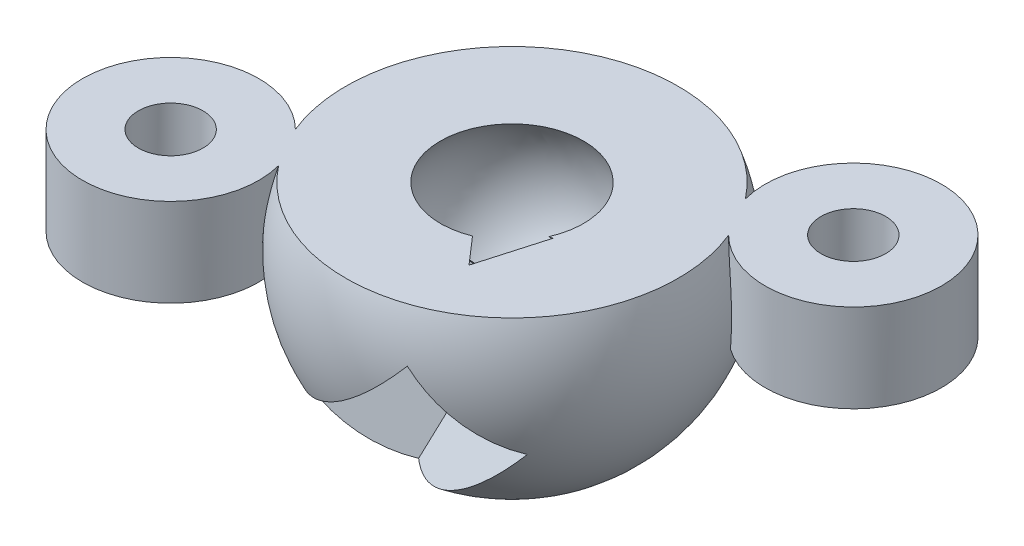
ISO-10303-21;
HEADER;
FILE_DESCRIPTION(('STEP AP214'),'2;1');
FILE_NAME('part.step','',(''),(''),'','','');
FILE_SCHEMA(('AUTOMOTIVE_DESIGN { 1 0 10303 214 1 1 1 1 }'));
ENDSEC;
DATA;
#1=APPLICATION_CONTEXT('core data for automotive mechanical design processes');
#2=APPLICATION_PROTOCOL_DEFINITION('international standard','automotive_design',2000,#1);
#3=PRODUCT_CONTEXT('',#1,'mechanical');
#4=PRODUCT('Part','Part','',(#3));
#5=PRODUCT_RELATED_PRODUCT_CATEGORY('part','',(#4));
#6=PRODUCT_DEFINITION_FORMATION('','',#4);
#7=PRODUCT_DEFINITION_CONTEXT('part definition',#1,'design');
#8=PRODUCT_DEFINITION('design','',#6,#7);
#9=PRODUCT_DEFINITION_SHAPE('','',#8);
#10=(LENGTH_UNIT() NAMED_UNIT(*) SI_UNIT(.MILLI.,.METRE.));
#11=(NAMED_UNIT(*) PLANE_ANGLE_UNIT() SI_UNIT($,.RADIAN.));
#12=(NAMED_UNIT(*) SI_UNIT($,.STERADIAN.) SOLID_ANGLE_UNIT());
#13=UNCERTAINTY_MEASURE_WITH_UNIT(LENGTH_MEASURE(1.E-05),#10,'distance_accuracy_value','');
#14=(GEOMETRIC_REPRESENTATION_CONTEXT(3) GLOBAL_UNCERTAINTY_ASSIGNED_CONTEXT((#13)) GLOBAL_UNIT_ASSIGNED_CONTEXT((#10,
#11,#12)) REPRESENTATION_CONTEXT('',''));
#15=CARTESIAN_POINT('',(0.,0.,0.));
#16=DIRECTION('',(0.,0.,1.));
#17=DIRECTION('',(1.,0.,0.));
#18=AXIS2_PLACEMENT_3D('',#15,#16,#17);
#19=CARTESIAN_POINT('',(-71.2916512459885,-73.,-25.9807621135332));
#20=DIRECTION('',(0.,-1.,0.));
#21=DIRECTION('',(0.5,0.,0.866025403784439));
#22=AXIS2_PLACEMENT_3D('',#19,#20,#21);
#23=SPHERICAL_SURFACE('',#22,5.99999999999999);
#24=CARTESIAN_POINT('',(-71.2916512459885,-71.,-25.9807621135332));
#25=DIRECTION('',(0.,-1.,0.));
#26=DIRECTION('',(0.,0.,-1.));
#27=AXIS2_PLACEMENT_3D('',#24,#25,#26);
#28=CIRCLE('',#27,5.65685424949238);
#29=CARTESIAN_POINT('',(-76.5335077636322,-71.,-23.8540415751369));
#30=VERTEX_POINT('',#29);
#31=CARTESIAN_POINT('',(-66.8289289741654,-71.,-29.4569827516075));
#32=VERTEX_POINT('',#31);
#33=EDGE_CURVE('E241',#30,#32,#28,.T.);
#34=ORIENTED_EDGE('',*,*,#33,.T.);
#35=CARTESIAN_POINT('',(-66.8288822258958,-70.9998000000002,-29.4568076588764));
#36=CARTESIAN_POINT('',(-66.8354414206612,-71.0278724460281,-29.4813823960372));
#37=CARTESIAN_POINT('',(-66.841445409668,-71.0567865660781,-29.5051093240685));
#38=CARTESIAN_POINT('',(-66.8524806169469,-71.1160434934823,-29.550902644208));
#39=CARTESIAN_POINT('',(-66.8575126129428,-71.1463851342514,-29.5729703552028));
#40=CARTESIAN_POINT('',(-66.8713343923544,-71.2389943886752,-29.6366255474556));
#41=CARTESIAN_POINT('',(-66.8788996674251,-71.3030725103162,-29.6758589353656));
#42=CARTESIAN_POINT('',(-66.8915697555255,-71.4339893832938,-29.7480515512125));
#43=CARTESIAN_POINT('',(-66.8966986091235,-71.5007937830544,-29.781070054829));
#44=CARTESIAN_POINT('',(-66.9052664855146,-71.6369688871942,-29.8417667876296));
#45=CARTESIAN_POINT('',(-66.9087034252679,-71.7063426425282,-29.8694384085501));
#46=CARTESIAN_POINT('',(-66.9152554415977,-71.8687142272826,-29.9275235502486));
#47=CARTESIAN_POINT('',(-66.9179411853033,-71.9623745047606,-29.9561321338083));
#48=CARTESIAN_POINT('',(-66.9220516329804,-72.151862770387,-30.0052942753258));
#49=CARTESIAN_POINT('',(-66.9234752841625,-72.2476925000111,-30.0258411005248));
#50=CARTESIAN_POINT('',(-66.9255828951422,-72.4413341169986,-30.0593722829475));
#51=CARTESIAN_POINT('',(-66.9262617698337,-72.5391550423465,-30.0723043750706));
#52=CARTESIAN_POINT('',(-66.9271749195194,-72.7354433347075,-30.0906365320708));
#53=CARTESIAN_POINT('',(-66.9274094347238,-72.8339103235679,-30.0960406659649));
#54=CARTESIAN_POINT('',(-66.9275536218137,-73.0229211548647,-30.0992954426495));
#55=CARTESIAN_POINT('',(-66.9274882514551,-73.1134555342486,-30.0977267476702));
#56=CARTESIAN_POINT('',(-66.9270545480834,-73.2941775183518,-30.0883089877937));
#57=CARTESIAN_POINT('',(-66.9266862868461,-73.3843652001413,-30.0804614108083));
#58=CARTESIAN_POINT('',(-66.925507090881,-73.5629332316183,-30.058492759671));
#59=CARTESIAN_POINT('',(-66.9247012652356,-73.6513224558665,-30.0444444341893));
#60=CARTESIAN_POINT('',(-66.922332433785,-73.8268475917444,-30.0098309259609));
#61=CARTESIAN_POINT('',(-66.9207690384522,-73.9139828348421,-29.9892623925339));
#62=CARTESIAN_POINT('',(-66.9186680551725,-74.0002,-29.9653095122775));
#63=B_SPLINE_CURVE_WITH_KNOTS('',3,(#35,#36,#37,#38,#39,#40,#41,#42,#43,#44,#45,#46,#47,#48,#49,
#50,#51,#52,#53,#54,#55,#56,#57,#58,#59,#60,#61,#62),.UNSPECIFIED.,.F.,.F.,(4,2,2,2,2,2,2,2,2,2,
2,2,2,4),(0.,0.113585797209044,0.227080330731855,0.453169231822974,0.676978393535343,
0.901062418299918,1.19454534747411,1.48827285917158,1.78399360635961,2.07955444826494,
2.35098507155562,2.62235139274863,2.89061526718653,3.15901722427217),.UNSPECIFIED.);
#64=CARTESIAN_POINT('',(-66.9186729955711,-74.,-29.9653651328283));
#65=VERTEX_POINT('',#64);
#66=EDGE_CURVE('E199',#32,#65,#63,.T.);
#67=ORIENTED_EDGE('',*,*,#66,.T.);
#68=CARTESIAN_POINT('',(-71.2916512459885,-74.,-25.9807621135332));
#69=DIRECTION('',(0.,-1.,0.));
#70=DIRECTION('',(0.,0.,-1.));
#71=AXIS2_PLACEMENT_3D('',#68,#69,#70);
#72=CIRCLE('',#71,5.91607978309961);
#73=CARTESIAN_POINT('',(-65.654394682074,-74.,-27.7755708589438));
#74=VERTEX_POINT('',#73);
#75=EDGE_CURVE('E246',#74,#65,#72,.F.);
#76=ORIENTED_EDGE('',*,*,#75,.F.);
#77=CARTESIAN_POINT('',(-65.6544403806847,-74.0002,-27.7756029477299));
#78=CARTESIAN_POINT('',(-65.642892880547,-73.9496620404665,-27.7674976990371));
#79=CARTESIAN_POINT('',(-65.6322628224998,-73.8988041487702,-27.7601511822679));
#80=CARTESIAN_POINT('',(-65.6128232199427,-73.7965686087353,-27.746871452643));
#81=CARTESIAN_POINT('',(-65.6040133121323,-73.7451910662704,-27.740937957713));
#82=CARTESIAN_POINT('',(-65.5802949194813,-73.5904873630535,-27.7251024781954));
#83=CARTESIAN_POINT('',(-65.568084640224,-73.4865322631475,-27.7171565006315));
#84=CARTESIAN_POINT('',(-65.550621318443,-73.275745133254,-27.7058650817838));
#85=CARTESIAN_POINT('',(-65.5455100824492,-73.1688967733632,-27.702613361609));
#86=CARTESIAN_POINT('',(-65.5426597638718,-72.9550449188532,-27.7007946397091));
#87=CARTESIAN_POINT('',(-65.5449216944912,-72.8480414049327,-27.7022282818354));
#88=CARTESIAN_POINT('',(-65.5568235037355,-72.6348501805667,-27.7098670650743));
#89=CARTESIAN_POINT('',(-65.5664470059613,-72.5286611870301,-27.7160616153137));
#90=CARTESIAN_POINT('',(-65.5931164782104,-72.3176550384307,-27.73361410612));
#91=CARTESIAN_POINT('',(-65.6101611263616,-72.212837642479,-27.7449711271512));
#92=CARTESIAN_POINT('',(-65.6515693836399,-72.0065978326293,-27.7734617518426));
#93=CARTESIAN_POINT('',(-65.6758539132732,-71.9051512731433,-27.7905331740777));
#94=CARTESIAN_POINT('',(-65.7319176945896,-71.7058549967529,-27.8316219363854));
#95=CARTESIAN_POINT('',(-65.7636903149968,-71.6080021854263,-27.8556331349905));
#96=CARTESIAN_POINT('',(-65.8337600791811,-71.4206435124872,-27.9114291278573));
#97=CARTESIAN_POINT('',(-65.8718158146403,-71.3309707282418,-27.9429404834129));
#98=CARTESIAN_POINT('',(-65.9343732350786,-71.2020077467898,-27.9980492879102));
#99=CARTESIAN_POINT('',(-65.956233326586,-71.1597920463395,-28.0178177275503));
#100=CARTESIAN_POINT('',(-66.0017492084471,-71.0778030739371,-28.0603659931893));
#101=CARTESIAN_POINT('',(-66.0254084367672,-71.0380347549418,-28.0831516496368));
#102=CARTESIAN_POINT('',(-66.0499229889615,-70.9997999999986,-28.1076106834807));
#103=B_SPLINE_CURVE_WITH_KNOTS('',3,(#77,#78,#79,#80,#81,#82,#83,#84,#85,#86,#87,#88,#89,#90,
#91,#92,#93,#94,#95,#96,#97,#98,#99,#100,#101,#102),.UNSPECIFIED.,.F.,.F.,(4,2,2,2,2,2,2,2,2,2,
2,2,4),(0.,0.157377048485897,0.314722654217848,0.629234458382262,0.949942579700582,
1.27069477382293,1.59073549691181,1.91071923689562,2.22732850930349,2.54365844666364,
2.84986255835406,3.00416307873573,3.15876624238513),.UNSPECIFIED.);
#104=CARTESIAN_POINT('',(-66.0497947283448,-71.,-28.1074826519294));
#105=VERTEX_POINT('',#104);
#106=EDGE_CURVE('E188',#74,#105,#103,.T.);
#107=ORIENTED_EDGE('',*,*,#106,.T.);
#108=CARTESIAN_POINT('',(-75.7543735178116,-71.,-22.5045414754588));
#109=VERTEX_POINT('',#108);
#110=EDGE_CURVE('E239',#105,#109,#28,.T.);
#111=ORIENTED_EDGE('',*,*,#110,.T.);
#112=CARTESIAN_POINT('',(-75.7544202660812,-70.9998000000002,-22.5047165681897));
#113=CARTESIAN_POINT('',(-75.7478610713158,-71.0278724460281,-22.480141831029));
#114=CARTESIAN_POINT('',(-75.741857082309,-71.0567865660781,-22.4564149029977));
#115=CARTESIAN_POINT('',(-75.7308218750301,-71.1160434934823,-22.4106215828581));
#116=CARTESIAN_POINT('',(-75.7257898790342,-71.1463851342514,-22.3885538718634));
#117=CARTESIAN_POINT('',(-75.7119680996226,-71.2389943886753,-22.3248986796105));
#118=CARTESIAN_POINT('',(-75.7044028245519,-71.3030725103163,-22.2856652917006));
#119=CARTESIAN_POINT('',(-75.6917327364516,-71.4339893832939,-22.2134726758537));
#120=CARTESIAN_POINT('',(-75.6866038828535,-71.5007937830545,-22.1804541722372));
#121=CARTESIAN_POINT('',(-75.6780360064624,-71.6369688871943,-22.1197574394365));
#122=CARTESIAN_POINT('',(-75.6745990667091,-71.7063426425283,-22.0920858185161));
#123=CARTESIAN_POINT('',(-75.6680470503794,-71.8687142272827,-22.0340006768176));
#124=CARTESIAN_POINT('',(-75.6653613066737,-71.9623745047608,-22.0053920932579));
#125=CARTESIAN_POINT('',(-75.6612508589966,-72.1518627703872,-21.9562299517404));
#126=CARTESIAN_POINT('',(-75.6598272078145,-72.2476925000112,-21.9356831265414));
#127=CARTESIAN_POINT('',(-75.6577195968348,-72.4413341169988,-21.9021519441187));
#128=CARTESIAN_POINT('',(-75.6570407221433,-72.5391550423467,-21.8892198519956));
#129=CARTESIAN_POINT('',(-75.6561275724576,-72.7354433347077,-21.8708876949954));
#130=CARTESIAN_POINT('',(-75.6558930572532,-72.8339103235682,-21.8654835611013));
#131=CARTESIAN_POINT('',(-75.6557488701633,-73.0229211548649,-21.8622287844167));
#132=CARTESIAN_POINT('',(-75.6558142405219,-73.1134555342488,-21.863797479396));
#133=CARTESIAN_POINT('',(-75.6562479438936,-73.294177518352,-21.8732152392726));
#134=CARTESIAN_POINT('',(-75.6566162051309,-73.3843652001414,-21.8810628162579));
#135=CARTESIAN_POINT('',(-75.6577954010961,-73.5629332316184,-21.9030314673953));
#136=CARTESIAN_POINT('',(-75.6586012267414,-73.6513224558665,-21.9170797928769));
#137=CARTESIAN_POINT('',(-75.660970058192,-73.8268475917444,-21.9516933011054));
#138=CARTESIAN_POINT('',(-75.6625334535248,-73.9139828348421,-21.9722618345323));
#139=CARTESIAN_POINT('',(-75.6646344368045,-74.0002,-21.9962147147887));
#140=B_SPLINE_CURVE_WITH_KNOTS('',3,(#112,#113,#114,#115,#116,#117,#118,#119,#120,#121,#122,
#123,#124,#125,#126,#127,#128,#129,#130,#131,#132,#133,#134,#135,#136,#137,#138,#139),
.UNSPECIFIED.,.F.,.F.,(4,2,2,2,2,2,2,2,2,2,2,2,2,4),(0.,0.113585797209057,0.227080330731909,
0.453169231823033,0.67697839353544,0.901062418300023,1.19454534747423,1.48827285917174,
1.78399360635981,2.07955444826517,2.35098507155577,2.62235139274873,2.89061526718655,
3.15901722427214),.UNSPECIFIED.);
#141=CARTESIAN_POINT('',(-75.6646294964059,-74.,-21.9961590942379));
#142=VERTEX_POINT('',#141);
#143=EDGE_CURVE('E234',#109,#142,#140,.T.);
#144=ORIENTED_EDGE('',*,*,#143,.T.);
#145=CARTESIAN_POINT('',(-71.2916512459885,-74.,-25.9807621135332));
#146=DIRECTION('',(0.,-1.,0.));
#147=DIRECTION('',(0.,0.,-1.));
#148=AXIS2_PLACEMENT_3D('',#145,#146,#147);
#149=CIRCLE('',#148,5.91607978309961);
#150=CARTESIAN_POINT('',(-76.9289078099031,-74.,-24.1859533681225));
#151=VERTEX_POINT('',#150);
#152=EDGE_CURVE('E243',#151,#142,#149,.F.);
#153=ORIENTED_EDGE('',*,*,#152,.F.);
#154=CARTESIAN_POINT('',(-76.9288621112924,-74.0002,-24.1859212793364));
#155=CARTESIAN_POINT('',(-76.9404096114301,-73.9496620404665,-24.1940265280293));
#156=CARTESIAN_POINT('',(-76.9510396694773,-73.8988041487702,-24.2013730447985));
#157=CARTESIAN_POINT('',(-76.9704792720344,-73.7965686087353,-24.2146527744234));
#158=CARTESIAN_POINT('',(-76.9792891798448,-73.7451910662703,-24.2205862693533));
#159=CARTESIAN_POINT('',(-77.0030075724958,-73.5904873630535,-24.236421748871));
#160=CARTESIAN_POINT('',(-77.0152178517531,-73.4865322631475,-24.2443677264348));
#161=CARTESIAN_POINT('',(-77.032681173534,-73.2757451332539,-24.2556591452825));
#162=CARTESIAN_POINT('',(-77.0377924095279,-73.1688967733631,-24.2589108654573));
#163=CARTESIAN_POINT('',(-77.0406427281053,-72.9550449188531,-24.2607295873572));
#164=CARTESIAN_POINT('',(-77.0383807974859,-72.8480414049326,-24.259295945231));
#165=CARTESIAN_POINT('',(-77.0264789882416,-72.6348501805666,-24.2516571619921));
#166=CARTESIAN_POINT('',(-77.0168554860158,-72.52866118703,-24.2454626117526));
#167=CARTESIAN_POINT('',(-76.9901860137667,-72.3176550384306,-24.2279101209463));
#168=CARTESIAN_POINT('',(-76.9731413656155,-72.2128376424789,-24.2165530999151));
#169=CARTESIAN_POINT('',(-76.9317331083372,-72.0065978326292,-24.1880624752238));
#170=CARTESIAN_POINT('',(-76.9074485787039,-71.9051512731432,-24.1709910529886));
#171=CARTESIAN_POINT('',(-76.8513847973874,-71.7058549967528,-24.129902290681));
#172=CARTESIAN_POINT('',(-76.8196121769803,-71.6080021854261,-24.1058910920759));
#173=CARTESIAN_POINT('',(-76.7495424127959,-71.4206435124871,-24.0500950992091));
#174=CARTESIAN_POINT('',(-76.7114866773368,-71.3309707282417,-24.0185837436535));
#175=CARTESIAN_POINT('',(-76.6489292568986,-71.2020077467898,-23.9634749391562));
#176=CARTESIAN_POINT('',(-76.6270691653911,-71.1597920463395,-23.9437064995161));
#177=CARTESIAN_POINT('',(-76.58155328353,-71.0778030739371,-23.9011582338771));
#178=CARTESIAN_POINT('',(-76.55789405521,-71.0380347549418,-23.8783725774296));
#179=CARTESIAN_POINT('',(-76.5333795030156,-70.9997999999986,-23.8539135435857));
#180=B_SPLINE_CURVE_WITH_KNOTS('',3,(#154,#155,#156,#157,#158,#159,#160,#161,#162,#163,#164,
#165,#166,#167,#168,#169,#170,#171,#172,#173,#174,#175,#176,#177,#178,#179),.UNSPECIFIED.,.F.,
.F.,(4,2,2,2,2,2,2,2,2,2,2,2,4),(0.,0.157377048485897,0.314722654217877,0.629234458382303,
0.949942579700665,1.27069477382301,1.5907354969119,1.91071923689573,2.22732850930363,
2.54365844666381,2.84986255835412,3.00416307873573,3.15876624238508),.UNSPECIFIED.);
#181=EDGE_CURVE('E227',#151,#30,#180,.T.);
#182=ORIENTED_EDGE('',*,*,#181,.T.);
#183=EDGE_LOOP('',(#34,#67,#76,#107,#111,#144,#153,#182));
#184=FACE_BOUND('',#183,.T.);
#185=CARTESIAN_POINT('',(-72.3829899580333,-71.7684504931306,-25.0308854753731));
#186=DIRECTION('',(0.57438879581302,-0.648183950983877,-0.499935072715847));
#187=DIRECTION('',(0.748425964464048,0.663218346938669,0.));
#188=AXIS2_PLACEMENT_3D('',#185,#186,#187);
#189=CIRCLE('',#188,5.69122131005287);
#190=CARTESIAN_POINT('',(-74.4159921177242,-76.0254293010476,-21.847328714824));
#191=VERTEX_POINT('',#190);
#192=CARTESIAN_POINT('',(-69.2324587112696,-72.5784404179814,-20.3609744285965));
#193=VERTEX_POINT('',#192);
#194=EDGE_CURVE('E135',#191,#193,#189,.F.);
#195=ORIENTED_EDGE('',*,*,#194,.T.);
#196=CARTESIAN_POINT('',(-68.6998845427612,-71.2765055584669,-25.2375849704194));
#197=DIRECTION('',(-0.809927094758531,-0.538592012979103,-0.232242857223047));
#198=DIRECTION('',(0.553732254118609,-0.832694776462975,0.));
#199=AXIS2_PLACEMENT_3D('',#196,#197,#198);
#200=CIRCLE('',#199,5.07543101617978);
#201=CARTESIAN_POINT('',(-67.0497812871801,-75.0415394317201,-22.2607277049167));
#202=VERTEX_POINT('',#201);
#203=EDGE_CURVE('E170',#193,#202,#200,.F.);
#204=ORIENTED_EDGE('',*,*,#203,.T.);
#205=CARTESIAN_POINT('',(-70.2003125339438,-74.2315495068694,-26.9306387516933));
#206=DIRECTION('',(-0.574388795813023,0.648183950983876,0.499935072715846));
#207=DIRECTION('',(-0.748425964464045,-0.663218346938672,0.));
#208=AXIS2_PLACEMENT_3D('',#205,#206,#207);
#209=CIRCLE('',#208,5.69122131005287);
#210=CARTESIAN_POINT('',(-72.2333146936347,-78.4885283147864,-23.7470819911442));
#211=VERTEX_POINT('',#210);
#212=EDGE_CURVE('E160',#202,#211,#209,.F.);
#213=ORIENTED_EDGE('',*,*,#212,.T.);
#214=CARTESIAN_POINT('',(-73.8834179492158,-74.7234944415331,-26.7239392566469));
#215=DIRECTION('',(0.809927094758531,0.538592012979103,0.232242857223047));
#216=DIRECTION('',(-0.553732254118609,0.832694776462975,0.));
#217=AXIS2_PLACEMENT_3D('',#214,#215,#216);
#218=CIRCLE('',#217,5.07543101617982);
#219=EDGE_CURVE('E11',#211,#191,#218,.F.);
#220=ORIENTED_EDGE('',*,*,#219,.T.);
#221=EDGE_LOOP('',(#195,#204,#213,#220));
#222=FACE_BOUND('',#221,.T.);
#223=ADVANCED_FACE('F41',(#184,#222),#23,.T.);
#224=CARTESIAN_POINT('',(-74.1200783707347,-71.,-30.8797415990995));
#225=DIRECTION('',(0.,1.,0.));
#226=DIRECTION('',(0.,0.,1.));
#227=AXIS2_PLACEMENT_3D('',#224,#225,#226);
#228=PLANE('',#227);
#229=CARTESIAN_POINT('',(-63.9304353138208,-71.,-30.2307621135332));
#230=DIRECTION('',(0.,1.,0.));
#231=DIRECTION('',(0.,0.,1.));
#232=AXIS2_PLACEMENT_3D('',#229,#230,#231);
#233=CIRCLE('',#232,1.1);
#234=CARTESIAN_POINT('',(-63.9304353138208,-71.,-29.1307621135332));
#235=VERTEX_POINT('',#234);
#236=EDGE_CURVE('E172',#235,#235,#233,.F.);
#237=ORIENTED_EDGE('',*,*,#236,.T.);
#238=EDGE_LOOP('',(#237));
#239=FACE_BOUND('',#238,.T.);
#240=CARTESIAN_POINT('',(-78.6528671781562,-71.,-21.7307621135332));
#241=DIRECTION('',(0.,1.,0.));
#242=DIRECTION('',(0.,0.,1.));
#243=AXIS2_PLACEMENT_3D('',#240,#241,#242);
#244=CIRCLE('',#243,1.1);
#245=CARTESIAN_POINT('',(-78.6528671781562,-71.,-20.6307621135332));
#246=VERTEX_POINT('',#245);
#247=EDGE_CURVE('E185',#246,#246,#244,.F.);
#248=ORIENTED_EDGE('',*,*,#247,.T.);
#249=EDGE_LOOP('',(#248));
#250=FACE_BOUND('',#249,.T.);
#251=ORIENTED_EDGE('',*,*,#110,.F.);
#252=CARTESIAN_POINT('',(-63.9304353138208,-71.,-30.2307621135332));
#253=DIRECTION('',(0.,-1.,0.));
#254=DIRECTION('',(0.,0.,-1.));
#255=AXIS2_PLACEMENT_3D('',#252,#253,#254);
#256=CIRCLE('',#255,3.);
#257=EDGE_CURVE('E192',#32,#105,#256,.T.);
#258=ORIENTED_EDGE('',*,*,#257,.F.);
#259=ORIENTED_EDGE('',*,*,#33,.F.);
#260=CARTESIAN_POINT('',(-78.6528671781562,-71.,-21.7307621135332));
#261=DIRECTION('',(0.,-1.,0.));
#262=DIRECTION('',(0.,0.,-1.));
#263=AXIS2_PLACEMENT_3D('',#260,#261,#262);
#264=CIRCLE('',#263,3.);
#265=EDGE_CURVE('E295',#109,#30,#264,.T.);
#266=ORIENTED_EDGE('',*,*,#265,.F.);
#267=EDGE_LOOP('',(#251,#258,#259,#266));
#268=FACE_BOUND('',#267,.T.);
#269=DIRECTION('',(-0.275637355817001,0.,0.961261695938318));
#270=VECTOR('',#269,1.);
#271=CARTESIAN_POINT('',(-67.7866482126503,-71.,-29.0636597252431));
#272=LINE('',#271,#270);
#273=CARTESIAN_POINT('',(-68.9449101940788,-71.,-25.0243201614579));
#274=VERTEX_POINT('',#273);
#275=CARTESIAN_POINT('',(-69.5805865905474,-71.,-22.8074531148044));
#276=VERTEX_POINT('',#275);
#277=EDGE_CURVE('E47',#274,#276,#272,.T.);
#278=ORIENTED_EDGE('',*,*,#277,.T.);
#279=DIRECTION('',(-0.65652752938185,0.,-0.754302063608317));
#280=VECTOR('',#279,1.);
#281=CARTESIAN_POINT('',(-75.5347957251093,-71.,-29.6484034730998));
#282=LINE('',#281,#280);
#283=CARTESIAN_POINT('',(-70.3789893275757,-71.,-23.7247594046077));
#284=VERTEX_POINT('',#283);
#285=EDGE_CURVE('E161',#276,#284,#282,.T.);
#286=ORIENTED_EDGE('',*,*,#285,.T.);
#287=CARTESIAN_POINT('',(-71.2916512459885,-71.,-25.9807621135332));
#288=DIRECTION('',(0.,1.,0.));
#289=DIRECTION('',(0.,0.,1.));
#290=AXIS2_PLACEMENT_3D('',#287,#288,#289);
#291=CIRCLE('',#290,2.4336187047276);
#292=CARTESIAN_POINT('',(-69.0609900978729,-71.,-25.0078022776265));
#293=VERTEX_POINT('',#292);
#294=EDGE_CURVE('E184',#293,#284,#291,.T.);
#295=ORIENTED_EDGE('',*,*,#294,.F.);
#296=DIRECTION('',(0.990026908932881,0.,-0.140878385811327));
#297=VECTOR('',#296,1.);
#298=CARTESIAN_POINT('',(-73.2006927646904,-71.,-24.418732804688));
#299=LINE('',#298,#297);
#300=EDGE_CURVE('E61',#293,#274,#299,.T.);
#301=ORIENTED_EDGE('',*,*,#300,.T.);
#302=EDGE_LOOP('',(#278,#286,#295,#301));
#303=FACE_BOUND('',#302,.T.);
#304=ADVANCED_FACE('F223',(#239,#250,#268,#303),#228,.T.);
#305=CARTESIAN_POINT('',(-71.2916512459885,-73.,-25.9807621135332));
#306=DIRECTION('',(-0.866025403784439,0.,0.5));
#307=DIRECTION('',(-0.5,0.,-0.866025403784439));
#308=AXIS2_PLACEMENT_3D('',#305,#306,#307);
#309=SPHERICAL_SURFACE('',#308,3.15);
#310=CARTESIAN_POINT('',(-72.3829899580333,-71.7684504931306,-25.030885475373));
#311=DIRECTION('',(0.57438879581302,-0.648183950983877,-0.499935072715847));
#312=DIRECTION('',(0.748425964464048,0.663218346938669,0.));
#313=AXIS2_PLACEMENT_3D('',#310,#311,#312);
#314=CIRCLE('',#313,2.51246890528022);
#315=CARTESIAN_POINT('',(-74.417906599158,-73.1216461783729,-25.6143884326193));
#316=VERTEX_POINT('',#315);
#317=EDGE_CURVE('E261',#316,#284,#314,.F.);
#318=ORIENTED_EDGE('',*,*,#317,.F.);
#319=CARTESIAN_POINT('',(-71.2916512459885,-73.,-25.9807621135331));
#320=DIRECTION('',(0.118724944390263,-0.538308656109162,0.834342962059054));
#321=DIRECTION('',(0.,-0.840286153588462,-0.542143136161944));
#322=AXIS2_PLACEMENT_3D('',#319,#320,#321);
#323=CIRCLE('',#322,3.15);
#324=CARTESIAN_POINT('',(-72.2352291750685,-75.5847451921117,-27.5141417089396));
#325=VERTEX_POINT('',#324);
#326=EDGE_CURVE('E141',#325,#316,#323,.F.);
#327=ORIENTED_EDGE('',*,*,#326,.F.);
#328=CARTESIAN_POINT('',(-70.2003125339438,-74.2315495068694,-26.9306387516933));
#329=DIRECTION('',(-0.574388795813023,0.648183950983876,0.499935072715846));
#330=DIRECTION('',(-0.748425964464045,-0.663218346938672,0.));
#331=AXIS2_PLACEMENT_3D('',#328,#329,#330);
#332=CIRCLE('',#331,2.51246890528022);
#333=CARTESIAN_POINT('',(-68.165395892819,-72.8783538216271,-26.3471357944469));
#334=VERTEX_POINT('',#333);
#335=EDGE_CURVE('E263',#334,#325,#332,.F.);
#336=ORIENTED_EDGE('',*,*,#335,.F.);
#337=EDGE_CURVE('E248',#293,#334,#323,.F.);
#338=ORIENTED_EDGE('',*,*,#337,.F.);
#339=ORIENTED_EDGE('',*,*,#294,.T.);
#340=EDGE_LOOP('',(#318,#327,#336,#338,#339));
#341=FACE_BOUND('',#340,.T.);
#342=ADVANCED_FACE('F277',(#341),#309,.F.);
#343=CARTESIAN_POINT('',(-63.9304353138208,-74.25,-30.2307621135332));
#344=DIRECTION('',(0.,1.,0.));
#345=DIRECTION('',(0.,0.,1.));
#346=AXIS2_PLACEMENT_3D('',#343,#344,#345);
#347=CYLINDRICAL_SURFACE('',#346,1.1);
#348=ORIENTED_EDGE('',*,*,#236,.F.);
#349=EDGE_LOOP('',(#348));
#350=FACE_BOUND('',#349,.T.);
#351=CARTESIAN_POINT('',(-63.9304353138208,-72.8,-30.2307621135332));
#352=DIRECTION('',(0.,-1.,0.));
#353=DIRECTION('',(0.,0.,-1.));
#354=AXIS2_PLACEMENT_3D('',#351,#352,#353);
#355=CIRCLE('',#354,1.1);
#356=CARTESIAN_POINT('',(-63.9304353138208,-72.8,-31.3307621135332));
#357=VERTEX_POINT('',#356);
#358=EDGE_CURVE('E173',#357,#357,#355,.T.);
#359=ORIENTED_EDGE('',*,*,#358,.T.);
#360=EDGE_LOOP('',(#359));
#361=FACE_BOUND('',#360,.T.);
#362=ADVANCED_FACE('F331',(#350,#361),#347,.F.);
#363=CARTESIAN_POINT('',(-78.6528671781562,-74.25,-21.7307621135332));
#364=DIRECTION('',(0.,1.,0.));
#365=DIRECTION('',(0.,0.,1.));
#366=AXIS2_PLACEMENT_3D('',#363,#364,#365);
#367=CYLINDRICAL_SURFACE('',#366,1.1);
#368=ORIENTED_EDGE('',*,*,#247,.F.);
#369=EDGE_LOOP('',(#368));
#370=FACE_BOUND('',#369,.T.);
#371=CARTESIAN_POINT('',(-78.6528671781562,-72.8,-21.7307621135332));
#372=DIRECTION('',(0.,-1.,0.));
#373=DIRECTION('',(0.,0.,-1.));
#374=AXIS2_PLACEMENT_3D('',#371,#372,#373);
#375=CIRCLE('',#374,1.1);
#376=CARTESIAN_POINT('',(-78.6528671781562,-72.8,-22.8307621135332));
#377=VERTEX_POINT('',#376);
#378=EDGE_CURVE('E181',#377,#377,#375,.T.);
#379=ORIENTED_EDGE('',*,*,#378,.T.);
#380=EDGE_LOOP('',(#379));
#381=FACE_BOUND('',#380,.T.);
#382=ADVANCED_FACE('F222',(#370,#381),#367,.F.);
#383=CARTESIAN_POINT('',(-78.6528671781562,-74.,-21.7307621135332));
#384=DIRECTION('',(0.,1.,0.));
#385=DIRECTION('',(0.,0.,1.));
#386=AXIS2_PLACEMENT_3D('',#383,#384,#385);
#387=CYLINDRICAL_SURFACE('',#386,3.);
#388=ORIENTED_EDGE('',*,*,#143,.F.);
#389=ORIENTED_EDGE('',*,*,#265,.T.);
#390=ORIENTED_EDGE('',*,*,#181,.F.);
#391=CARTESIAN_POINT('',(-78.6528671781562,-74.,-21.7307621135332));
#392=DIRECTION('',(0.,-1.,0.));
#393=DIRECTION('',(0.,0.,-1.));
#394=AXIS2_PLACEMENT_3D('',#391,#392,#393);
#395=CIRCLE('',#394,3.);
#396=EDGE_CURVE('E299',#142,#151,#395,.T.);
#397=ORIENTED_EDGE('',*,*,#396,.F.);
#398=EDGE_LOOP('',(#388,#389,#390,#397));
#399=FACE_BOUND('',#398,.T.);
#400=ADVANCED_FACE('F216',(#399),#387,.T.);
#401=CARTESIAN_POINT('',(-78.6528671781562,-74.,-21.7307621135332));
#402=DIRECTION('',(0.,-1.,0.));
#403=DIRECTION('',(0.,0.,-1.));
#404=AXIS2_PLACEMENT_3D('',#401,#402,#403);
#405=PLANE('',#404);
#406=CARTESIAN_POINT('',(-78.6528671781562,-74.,-21.7307621135332));
#407=DIRECTION('',(0.,-1.,0.));
#408=DIRECTION('',(0.,0.,-1.));
#409=AXIS2_PLACEMENT_3D('',#406,#407,#408);
#410=CIRCLE('',#409,2.1);
#411=CARTESIAN_POINT('',(-78.6528671781562,-74.,-23.8307621135332));
#412=VERTEX_POINT('',#411);
#413=EDGE_CURVE('E187',#412,#412,#410,.F.);
#414=ORIENTED_EDGE('',*,*,#413,.T.);
#415=EDGE_LOOP('',(#414));
#416=FACE_BOUND('',#415,.T.);
#417=ORIENTED_EDGE('',*,*,#396,.T.);
#418=ORIENTED_EDGE('',*,*,#152,.T.);
#419=EDGE_LOOP('',(#417,#418));
#420=FACE_BOUND('',#419,.T.);
#421=ADVANCED_FACE('F215',(#416,#420),#405,.T.);
#422=CARTESIAN_POINT('',(-63.9304353138208,-74.,-30.2307621135332));
#423=DIRECTION('',(0.,1.,0.));
#424=DIRECTION('',(0.,0.,1.));
#425=AXIS2_PLACEMENT_3D('',#422,#423,#424);
#426=CYLINDRICAL_SURFACE('',#425,3.);
#427=ORIENTED_EDGE('',*,*,#66,.F.);
#428=ORIENTED_EDGE('',*,*,#257,.T.);
#429=ORIENTED_EDGE('',*,*,#106,.F.);
#430=CARTESIAN_POINT('',(-63.9304353138208,-74.,-30.2307621135332));
#431=DIRECTION('',(0.,-1.,0.));
#432=DIRECTION('',(0.,0.,-1.));
#433=AXIS2_PLACEMENT_3D('',#430,#431,#432);
#434=CIRCLE('',#433,3.);
#435=EDGE_CURVE('E190',#65,#74,#434,.T.);
#436=ORIENTED_EDGE('',*,*,#435,.F.);
#437=EDGE_LOOP('',(#427,#428,#429,#436));
#438=FACE_BOUND('',#437,.T.);
#439=ADVANCED_FACE('F207',(#438),#426,.T.);
#440=CARTESIAN_POINT('',(-63.9304353138208,-74.,-30.2307621135332));
#441=DIRECTION('',(0.,-1.,0.));
#442=DIRECTION('',(0.,0.,-1.));
#443=AXIS2_PLACEMENT_3D('',#440,#441,#442);
#444=PLANE('',#443);
#445=CARTESIAN_POINT('',(-63.9304353138208,-74.,-30.2307621135332));
#446=DIRECTION('',(0.,-1.,0.));
#447=DIRECTION('',(0.,0.,-1.));
#448=AXIS2_PLACEMENT_3D('',#445,#446,#447);
#449=CIRCLE('',#448,2.1);
#450=CARTESIAN_POINT('',(-63.9304353138208,-74.,-32.3307621135332));
#451=VERTEX_POINT('',#450);
#452=EDGE_CURVE('E178',#451,#451,#449,.F.);
#453=ORIENTED_EDGE('',*,*,#452,.T.);
#454=EDGE_LOOP('',(#453));
#455=FACE_BOUND('',#454,.T.);
#456=ORIENTED_EDGE('',*,*,#435,.T.);
#457=ORIENTED_EDGE('',*,*,#75,.T.);
#458=EDGE_LOOP('',(#456,#457));
#459=FACE_BOUND('',#458,.T.);
#460=ADVANCED_FACE('F212',(#455,#459),#444,.T.);
#461=CARTESIAN_POINT('',(-78.6528671781562,-74.25,-21.7307621135332));
#462=DIRECTION('',(0.,1.,0.));
#463=DIRECTION('',(0.,0.,1.));
#464=AXIS2_PLACEMENT_3D('',#461,#462,#463);
#465=CYLINDRICAL_SURFACE('',#464,2.1);
#466=ORIENTED_EDGE('',*,*,#413,.F.);
#467=EDGE_LOOP('',(#466));
#468=FACE_BOUND('',#467,.T.);
#469=CARTESIAN_POINT('',(-78.6528671781562,-72.8,-21.7307621135332));
#470=DIRECTION('',(0.,-1.,0.));
#471=DIRECTION('',(0.,0.,-1.));
#472=AXIS2_PLACEMENT_3D('',#469,#470,#471);
#473=CIRCLE('',#472,2.1);
#474=CARTESIAN_POINT('',(-78.6528671781562,-72.8,-23.8307621135332));
#475=VERTEX_POINT('',#474);
#476=EDGE_CURVE('E180',#475,#475,#473,.T.);
#477=ORIENTED_EDGE('',*,*,#476,.F.);
#478=EDGE_LOOP('',(#477));
#479=FACE_BOUND('',#478,.T.);
#480=ADVANCED_FACE('F303',(#468,#479),#465,.F.);
#481=CARTESIAN_POINT('',(-78.6528671781562,-72.8,-21.7307621135332));
#482=DIRECTION('',(0.,-1.,0.));
#483=DIRECTION('',(0.,0.,-1.));
#484=AXIS2_PLACEMENT_3D('',#481,#482,#483);
#485=PLANE('',#484);
#486=ORIENTED_EDGE('',*,*,#378,.F.);
#487=EDGE_LOOP('',(#486));
#488=FACE_BOUND('',#487,.T.);
#489=ORIENTED_EDGE('',*,*,#476,.T.);
#490=EDGE_LOOP('',(#489));
#491=FACE_BOUND('',#490,.T.);
#492=ADVANCED_FACE('F309',(#488,#491),#485,.T.);
#493=CARTESIAN_POINT('',(-63.9304353138208,-74.25,-30.2307621135332));
#494=DIRECTION('',(0.,1.,0.));
#495=DIRECTION('',(0.,0.,1.));
#496=AXIS2_PLACEMENT_3D('',#493,#494,#495);
#497=CYLINDRICAL_SURFACE('',#496,2.1);
#498=ORIENTED_EDGE('',*,*,#452,.F.);
#499=EDGE_LOOP('',(#498));
#500=FACE_BOUND('',#499,.T.);
#501=CARTESIAN_POINT('',(-63.9304353138208,-72.8,-30.2307621135332));
#502=DIRECTION('',(0.,-1.,0.));
#503=DIRECTION('',(0.,0.,-1.));
#504=AXIS2_PLACEMENT_3D('',#501,#502,#503);
#505=CIRCLE('',#504,2.1);
#506=CARTESIAN_POINT('',(-63.9304353138208,-72.8,-32.3307621135332));
#507=VERTEX_POINT('',#506);
#508=EDGE_CURVE('E167',#507,#507,#505,.T.);
#509=ORIENTED_EDGE('',*,*,#508,.F.);
#510=EDGE_LOOP('',(#509));
#511=FACE_BOUND('',#510,.T.);
#512=ADVANCED_FACE('F314',(#500,#511),#497,.F.);
#513=CARTESIAN_POINT('',(-63.9304353138208,-72.8,-30.2307621135332));
#514=DIRECTION('',(0.,-1.,0.));
#515=DIRECTION('',(0.,0.,-1.));
#516=AXIS2_PLACEMENT_3D('',#513,#514,#515);
#517=PLANE('',#516);
#518=ORIENTED_EDGE('',*,*,#358,.F.);
#519=EDGE_LOOP('',(#518));
#520=FACE_BOUND('',#519,.T.);
#521=ORIENTED_EDGE('',*,*,#508,.T.);
#522=EDGE_LOOP('',(#521));
#523=FACE_BOUND('',#522,.T.);
#524=ADVANCED_FACE('F320',(#520,#523),#517,.T.);
#525=CARTESIAN_POINT('',(-71.6048297932684,-81.3381305094941,-19.3303862742164));
#526=DIRECTION('',(-0.574388795813023,0.648183950983876,0.499935072715846));
#527=DIRECTION('',(-0.748425964464045,-0.663218346938672,0.));
#528=AXIS2_PLACEMENT_3D('',#525,#526,#527);
#529=PLANE('',#528);
#530=DIRECTION('',(-0.118724944390263,0.538308656109162,-0.834342962059055));
#531=VECTOR('',#530,1.);
#532=CARTESIAN_POINT('',(-66.4212963868138,-77.8911416264279,-17.8440319879889));
#533=LINE('',#532,#531);
#534=CARTESIAN_POINT('',(-67.6085458307165,-72.5080550653363,-26.1874616085795));
#535=VERTEX_POINT('',#534);
#536=EDGE_CURVE('E152',#202,#535,#533,.T.);
#537=ORIENTED_EDGE('',*,*,#536,.T.);
#538=DIRECTION('',(0.809927094758531,0.538592012979102,0.232242857223047));
#539=VECTOR('',#538,1.);
#540=CARTESIAN_POINT('',(-72.7920792371711,-75.9550439484025,-27.673815894807));
#541=LINE('',#540,#539);
#542=EDGE_CURVE('E150',#334,#535,#541,.T.);
#543=ORIENTED_EDGE('',*,*,#542,.F.);
#544=ORIENTED_EDGE('',*,*,#335,.T.);
#545=CARTESIAN_POINT('',(-72.7920792371711,-75.9550439484025,-27.673815894807));
#546=VERTEX_POINT('',#545);
#547=EDGE_CURVE('E148',#546,#325,#541,.T.);
#548=ORIENTED_EDGE('',*,*,#547,.F.);
#549=DIRECTION('',(-0.118724944390263,0.538308656109162,-0.834342962059055));
#550=VECTOR('',#549,1.);
#551=CARTESIAN_POINT('',(-71.6048297932684,-81.3381305094941,-19.3303862742164));
#552=LINE('',#551,#550);
#553=EDGE_CURVE('E57',#211,#546,#552,.T.);
#554=ORIENTED_EDGE('',*,*,#553,.F.);
#555=ORIENTED_EDGE('',*,*,#212,.F.);
#556=EDGE_LOOP('',(#537,#543,#544,#548,#554,#555));
#557=FACE_BOUND('',#556,.T.);
#558=ADVANCED_FACE('F274',(#557),#529,.T.);
#559=CARTESIAN_POINT('',(1.08699436671565,-4.92852180095794,7.6388841816246));
#560=DIRECTION('',(0.118724944390263,-0.538308656109162,0.834342962059054));
#561=DIRECTION('',(0.,-0.840286153588462,-0.542143136161944));
#562=AXIS2_PLACEMENT_3D('',#559,#560,#561);
#563=PLANE('',#562);
#564=ORIENTED_EDGE('',*,*,#326,.T.);
#565=DIRECTION('',(-0.809927094758533,-0.538592012979099,-0.232242857223045));
#566=VECTOR('',#565,1.);
#567=CARTESIAN_POINT('',(-69.791223254806,-70.0449560515975,-24.2877083322593));
#568=LINE('',#567,#566);
#569=CARTESIAN_POINT('',(-74.9747566612606,-73.4919449346638,-25.7740626184867));
#570=VERTEX_POINT('',#569);
#571=EDGE_CURVE('E129',#316,#570,#568,.T.);
#572=ORIENTED_EDGE('',*,*,#571,.T.);
#573=DIRECTION('',(0.574388795813023,-0.648183950983874,-0.499935072715847));
#574=VECTOR('',#573,1.);
#575=CARTESIAN_POINT('',(-74.9747566612606,-73.4919449346638,-25.7740626184867));
#576=LINE('',#575,#574);
#577=EDGE_CURVE('E142',#570,#546,#576,.T.);
#578=ORIENTED_EDGE('',*,*,#577,.T.);
#579=ORIENTED_EDGE('',*,*,#547,.T.);
#580=EDGE_LOOP('',(#564,#572,#578,#579));
#581=FACE_BOUND('',#580,.T.);
#582=ADVANCED_FACE('F138',(#581),#563,.T.);
#583=CARTESIAN_POINT('',(-66.4212963868138,-77.8911416264279,-17.8440319879889));
#584=DIRECTION('',(-0.809927094758531,-0.538592012979103,-0.232242857223047));
#585=DIRECTION('',(0.553732254118609,-0.832694776462975,0.));
#586=AXIS2_PLACEMENT_3D('',#583,#584,#585);
#587=PLANE('',#586);
#588=DIRECTION('',(-0.118724944390263,0.538308656109162,-0.834342962059055));
#589=VECTOR('',#588,1.);
#590=CARTESIAN_POINT('',(-68.6039738109033,-75.4280426126892,-15.9442787116687));
#591=LINE('',#590,#589);
#592=EDGE_CURVE('E134',#193,#276,#591,.T.);
#593=ORIENTED_EDGE('',*,*,#592,.T.);
#594=ORIENTED_EDGE('',*,*,#277,.F.);
#595=DIRECTION('',(-0.574388795813023,0.648183950983875,0.499935072715847));
#596=VECTOR('',#595,1.);
#597=CARTESIAN_POINT('',(-67.6085458307165,-72.5080550653363,-26.1874616085795));
#598=LINE('',#597,#596);
#599=EDGE_CURVE('E144',#535,#274,#598,.T.);
#600=ORIENTED_EDGE('',*,*,#599,.F.);
#601=ORIENTED_EDGE('',*,*,#536,.F.);
#602=ORIENTED_EDGE('',*,*,#203,.F.);
#603=EDGE_LOOP('',(#593,#594,#600,#601,#602));
#604=FACE_BOUND('',#603,.T.);
#605=ADVANCED_FACE('F268',(#604),#587,.T.);
#606=CARTESIAN_POINT('',(-68.6039738109033,-75.4280426126892,-15.9442787116687));
#607=DIRECTION('',(0.57438879581302,-0.648183950983877,-0.499935072715847));
#608=DIRECTION('',(0.748425964464048,0.663218346938669,0.));
#609=AXIS2_PLACEMENT_3D('',#606,#607,#608);
#610=PLANE('',#609);
#611=DIRECTION('',(-0.118724944390263,0.538308656109162,-0.834342962059055));
#612=VECTOR('',#611,1.);
#613=CARTESIAN_POINT('',(-73.7875072173579,-78.8750314957554,-17.4306329978962));
#614=LINE('',#613,#612);
#615=EDGE_CURVE('E123',#191,#570,#614,.T.);
#616=ORIENTED_EDGE('',*,*,#615,.T.);
#617=ORIENTED_EDGE('',*,*,#571,.F.);
#618=ORIENTED_EDGE('',*,*,#317,.T.);
#619=ORIENTED_EDGE('',*,*,#285,.F.);
#620=ORIENTED_EDGE('',*,*,#592,.F.);
#621=ORIENTED_EDGE('',*,*,#194,.F.);
#622=EDGE_LOOP('',(#616,#617,#618,#619,#620,#621));
#623=FACE_BOUND('',#622,.T.);
#624=ADVANCED_FACE('F130',(#623),#610,.T.);
#625=CARTESIAN_POINT('',(-73.7875072173579,-78.8750314957554,-17.4306329978962));
#626=DIRECTION('',(0.809927094758531,0.538592012979103,0.232242857223047));
#627=DIRECTION('',(-0.553732254118609,0.832694776462975,0.));
#628=AXIS2_PLACEMENT_3D('',#625,#626,#627);
#629=PLANE('',#628);
#630=ORIENTED_EDGE('',*,*,#553,.T.);
#631=ORIENTED_EDGE('',*,*,#577,.F.);
#632=ORIENTED_EDGE('',*,*,#615,.F.);
#633=ORIENTED_EDGE('',*,*,#219,.F.);
#634=EDGE_LOOP('',(#630,#631,#632,#633));
#635=FACE_BOUND('',#634,.T.);
#636=ADVANCED_FACE('F147',(#635),#629,.T.);
#637=ORIENTED_EDGE('',*,*,#337,.T.);
#638=ORIENTED_EDGE('',*,*,#542,.T.);
#639=ORIENTED_EDGE('',*,*,#599,.T.);
#640=ORIENTED_EDGE('',*,*,#300,.F.);
#641=EDGE_LOOP('',(#637,#638,#639,#640));
#642=FACE_BOUND('',#641,.T.);
#643=ADVANCED_FACE('F272',(#642),#563,.T.);
#644=CLOSED_SHELL('',(#223,#304,#342,#362,#382,#400,#421,#439,#460,#480,#492,#512,#524,#558,
#582,#605,#624,#636,#643));
#645=MANIFOLD_SOLID_BREP('B2',#644);
#646=ADVANCED_BREP_SHAPE_REPRESENTATION('',(#18,#645),#14);
#647=SHAPE_DEFINITION_REPRESENTATION(#9,#646);
ENDSEC;
END-ISO-10303-21;
